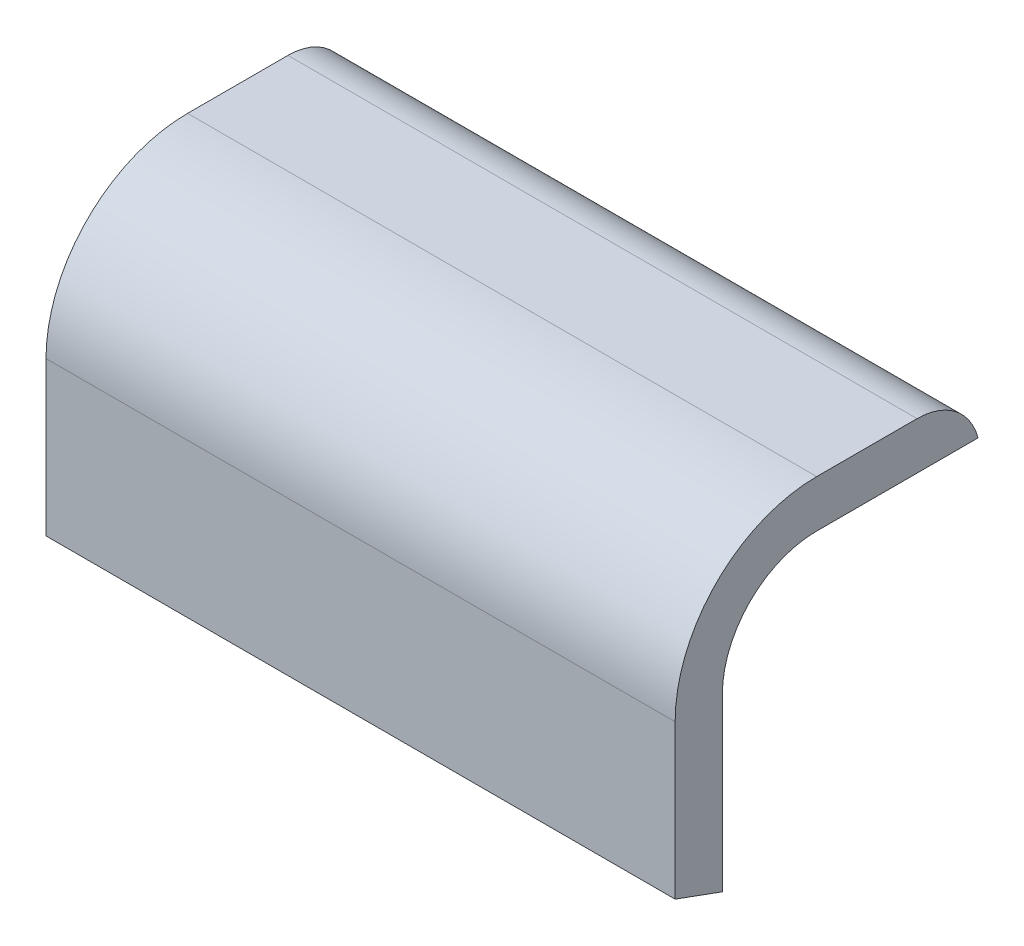
ISO-10303-21;
HEADER;
FILE_DESCRIPTION(('STEP AP214'),'2;1');
FILE_NAME('part.step','',(''),(''),'','','');
FILE_SCHEMA(('AUTOMOTIVE_DESIGN { 1 0 10303 214 1 1 1 1 }'));
ENDSEC;
DATA;
#1=APPLICATION_CONTEXT('core data for automotive mechanical design processes');
#2=APPLICATION_PROTOCOL_DEFINITION('international standard','automotive_design',2000,#1);
#3=PRODUCT_CONTEXT('',#1,'mechanical');
#4=PRODUCT('Part','Part','',(#3));
#5=PRODUCT_RELATED_PRODUCT_CATEGORY('part','',(#4));
#6=PRODUCT_DEFINITION_FORMATION('','',#4);
#7=PRODUCT_DEFINITION_CONTEXT('part definition',#1,'design');
#8=PRODUCT_DEFINITION('design','',#6,#7);
#9=PRODUCT_DEFINITION_SHAPE('','',#8);
#10=(LENGTH_UNIT() NAMED_UNIT(*) SI_UNIT(.MILLI.,.METRE.));
#11=(NAMED_UNIT(*) PLANE_ANGLE_UNIT() SI_UNIT($,.RADIAN.));
#12=(NAMED_UNIT(*) SI_UNIT($,.STERADIAN.) SOLID_ANGLE_UNIT());
#13=UNCERTAINTY_MEASURE_WITH_UNIT(LENGTH_MEASURE(1.E-05),#10,'distance_accuracy_value','');
#14=(GEOMETRIC_REPRESENTATION_CONTEXT(3) GLOBAL_UNCERTAINTY_ASSIGNED_CONTEXT((#13)) GLOBAL_UNIT_ASSIGNED_CONTEXT((#10,
#11,#12)) REPRESENTATION_CONTEXT('',''));
#15=CARTESIAN_POINT('',(0.,0.,0.));
#16=DIRECTION('',(0.,0.,1.));
#17=DIRECTION('',(1.,0.,0.));
#18=AXIS2_PLACEMENT_3D('',#15,#16,#17);
#19=CARTESIAN_POINT('',(50.,7.5,-20.32));
#20=DIRECTION('',(-1.,0.,0.));
#21=DIRECTION('',(0.,0.,1.));
#22=AXIS2_PLACEMENT_3D('',#19,#20,#21);
#23=PLANE('',#22);
#24=DIRECTION('',(0.,0.,-1.));
#25=VECTOR('',#24,1.);
#26=CARTESIAN_POINT('',(50.,7.5,-20.32));
#27=LINE('',#26,#25);
#28=CARTESIAN_POINT('',(50.,7.5,5.32));
#29=VERTEX_POINT('',#28);
#30=CARTESIAN_POINT('',(50.,7.5,-10.6375416344815));
#31=VERTEX_POINT('',#30);
#32=EDGE_CURVE('E132',#29,#31,#27,.T.);
#33=ORIENTED_EDGE('',*,*,#32,.F.);
#34=CARTESIAN_POINT('',(50.,-15.,5.32));
#35=DIRECTION('',(-1.,0.,0.));
#36=DIRECTION('',(0.,0.,1.));
#37=AXIS2_PLACEMENT_3D('',#34,#35,#36);
#38=CIRCLE('',#37,22.5);
#39=CARTESIAN_POINT('',(50.,-15.,27.82));
#40=VERTEX_POINT('',#39);
#41=EDGE_CURVE('E55',#29,#40,#38,.F.);
#42=ORIENTED_EDGE('',*,*,#41,.T.);
#43=DIRECTION('',(0.,1.,0.));
#44=VECTOR('',#43,1.);
#45=CARTESIAN_POINT('',(50.,-39.42,27.82));
#46=LINE('',#45,#44);
#47=CARTESIAN_POINT('',(50.,-39.42,27.82));
#48=VERTEX_POINT('',#47);
#49=EDGE_CURVE('E129',#48,#40,#46,.T.);
#50=ORIENTED_EDGE('',*,*,#49,.F.);
#51=DIRECTION('',(0.,-0.343150457665596,-0.939280449814587));
#52=VECTOR('',#51,1.);
#53=CARTESIAN_POINT('',(50.,-42.16,20.32));
#54=LINE('',#53,#52);
#55=CARTESIAN_POINT('',(50.,-42.16,20.32));
#56=VERTEX_POINT('',#55);
#57=EDGE_CURVE('E118',#48,#56,#54,.T.);
#58=ORIENTED_EDGE('',*,*,#57,.T.);
#59=DIRECTION('',(0.,1.,0.));
#60=VECTOR('',#59,1.);
#61=CARTESIAN_POINT('',(50.,-39.42,20.32));
#62=LINE('',#61,#60);
#63=CARTESIAN_POINT('',(50.,-15.,20.32));
#64=VERTEX_POINT('',#63);
#65=EDGE_CURVE('E110',#56,#64,#62,.T.);
#66=ORIENTED_EDGE('',*,*,#65,.T.);
#67=CARTESIAN_POINT('',(50.,-15.,5.32));
#68=DIRECTION('',(-1.,0.,0.));
#69=DIRECTION('',(0.,0.,1.));
#70=AXIS2_PLACEMENT_3D('',#67,#68,#69);
#71=CIRCLE('',#70,15.);
#72=CARTESIAN_POINT('',(50.,0.,5.32));
#73=VERTEX_POINT('',#72);
#74=EDGE_CURVE('E155',#64,#73,#71,.T.);
#75=ORIENTED_EDGE('',*,*,#74,.T.);
#76=DIRECTION('',(0.,0.,-1.));
#77=VECTOR('',#76,1.);
#78=CARTESIAN_POINT('',(50.,0.,-20.32));
#79=LINE('',#78,#77);
#80=CARTESIAN_POINT('',(50.,0.,-20.32));
#81=VERTEX_POINT('',#80);
#82=EDGE_CURVE('E109',#73,#81,#79,.T.);
#83=ORIENTED_EDGE('',*,*,#82,.T.);
#84=CARTESIAN_POINT('',(50.,-2.5,-10.6375416344815));
#85=DIRECTION('',(-1.,0.,0.));
#86=DIRECTION('',(0.,0.,1.));
#87=AXIS2_PLACEMENT_3D('',#84,#85,#86);
#88=CIRCLE('',#87,10.);
#89=EDGE_CURVE('E148',#81,#31,#88,.F.);
#90=ORIENTED_EDGE('',*,*,#89,.T.);
#91=EDGE_LOOP('',(#33,#42,#50,#58,#66,#75,#83,#90));
#92=FACE_BOUND('',#91,.T.);
#93=ADVANCED_FACE('F33',(#92),#23,.F.);
#94=CARTESIAN_POINT('',(-50.,7.5,-20.32));
#95=DIRECTION('',(1.,0.,0.));
#96=DIRECTION('',(0.,0.,-1.));
#97=AXIS2_PLACEMENT_3D('',#94,#95,#96);
#98=PLANE('',#97);
#99=DIRECTION('',(0.,1.,0.));
#100=VECTOR('',#99,1.);
#101=CARTESIAN_POINT('',(-50.,-39.42,27.82));
#102=LINE('',#101,#100);
#103=CARTESIAN_POINT('',(-50.,-39.42,27.82));
#104=VERTEX_POINT('',#103);
#105=CARTESIAN_POINT('',(-50.,-15.,27.82));
#106=VERTEX_POINT('',#105);
#107=EDGE_CURVE('E126',#104,#106,#102,.T.);
#108=ORIENTED_EDGE('',*,*,#107,.T.);
#109=CARTESIAN_POINT('',(-50.,-15.,5.32));
#110=DIRECTION('',(1.,0.,0.));
#111=DIRECTION('',(0.,0.,-1.));
#112=AXIS2_PLACEMENT_3D('',#109,#110,#111);
#113=CIRCLE('',#112,22.5);
#114=CARTESIAN_POINT('',(-50.,7.5,5.32));
#115=VERTEX_POINT('',#114);
#116=EDGE_CURVE('E11',#106,#115,#113,.F.);
#117=ORIENTED_EDGE('',*,*,#116,.T.);
#118=DIRECTION('',(0.,0.,1.));
#119=VECTOR('',#118,1.);
#120=CARTESIAN_POINT('',(-50.,7.5,-20.32));
#121=LINE('',#120,#119);
#122=CARTESIAN_POINT('',(-50.,7.5,-10.6375416344815));
#123=VERTEX_POINT('',#122);
#124=EDGE_CURVE('E134',#123,#115,#121,.T.);
#125=ORIENTED_EDGE('',*,*,#124,.F.);
#126=CARTESIAN_POINT('',(-50.,-2.5,-10.6375416344815));
#127=DIRECTION('',(1.,0.,0.));
#128=DIRECTION('',(0.,0.,-1.));
#129=AXIS2_PLACEMENT_3D('',#126,#127,#128);
#130=CIRCLE('',#129,10.);
#131=CARTESIAN_POINT('',(-50.,0.,-20.32));
#132=VERTEX_POINT('',#131);
#133=EDGE_CURVE('E146',#123,#132,#130,.F.);
#134=ORIENTED_EDGE('',*,*,#133,.T.);
#135=DIRECTION('',(0.,0.,1.));
#136=VECTOR('',#135,1.);
#137=CARTESIAN_POINT('',(-50.,0.,-20.32));
#138=LINE('',#137,#136);
#139=CARTESIAN_POINT('',(-50.,0.,5.32));
#140=VERTEX_POINT('',#139);
#141=EDGE_CURVE('E135',#132,#140,#138,.T.);
#142=ORIENTED_EDGE('',*,*,#141,.T.);
#143=CARTESIAN_POINT('',(-50.,-15.,5.32));
#144=DIRECTION('',(1.,0.,0.));
#145=DIRECTION('',(0.,0.,-1.));
#146=AXIS2_PLACEMENT_3D('',#143,#144,#145);
#147=CIRCLE('',#146,15.);
#148=CARTESIAN_POINT('',(-50.,-15.,20.32));
#149=VERTEX_POINT('',#148);
#150=EDGE_CURVE('E105',#140,#149,#147,.T.);
#151=ORIENTED_EDGE('',*,*,#150,.T.);
#152=DIRECTION('',(0.,1.,0.));
#153=VECTOR('',#152,1.);
#154=CARTESIAN_POINT('',(-50.,-39.42,20.32));
#155=LINE('',#154,#153);
#156=CARTESIAN_POINT('',(-50.,-42.16,20.32));
#157=VERTEX_POINT('',#156);
#158=EDGE_CURVE('E98',#157,#149,#155,.T.);
#159=ORIENTED_EDGE('',*,*,#158,.F.);
#160=DIRECTION('',(0.,0.343150457665596,0.939280449814587));
#161=VECTOR('',#160,1.);
#162=CARTESIAN_POINT('',(-50.,-42.16,20.32));
#163=LINE('',#162,#161);
#164=EDGE_CURVE('E102',#157,#104,#163,.T.);
#165=ORIENTED_EDGE('',*,*,#164,.T.);
#166=EDGE_LOOP('',(#108,#117,#125,#134,#142,#151,#159,#165));
#167=FACE_BOUND('',#166,.T.);
#168=ADVANCED_FACE('F100',(#167),#98,.F.);
#169=CARTESIAN_POINT('',(0.,7.5,0.));
#170=DIRECTION('',(0.,1.,0.));
#171=DIRECTION('',(0.,0.,1.));
#172=AXIS2_PLACEMENT_3D('',#169,#170,#171);
#173=PLANE('',#172);
#174=ORIENTED_EDGE('',*,*,#124,.T.);
#175=DIRECTION('',(1.,0.,0.));
#176=VECTOR('',#175,1.);
#177=CARTESIAN_POINT('',(0.,7.5,5.32));
#178=LINE('',#177,#176);
#179=EDGE_CURVE('E158',#115,#29,#178,.T.);
#180=ORIENTED_EDGE('',*,*,#179,.T.);
#181=ORIENTED_EDGE('',*,*,#32,.T.);
#182=DIRECTION('',(1.,0.,0.));
#183=VECTOR('',#182,1.);
#184=CARTESIAN_POINT('',(-50.,7.5,-10.6375416344815));
#185=LINE('',#184,#183);
#186=EDGE_CURVE('E138',#31,#123,#185,.F.);
#187=ORIENTED_EDGE('',*,*,#186,.T.);
#188=EDGE_LOOP('',(#174,#180,#181,#187));
#189=FACE_BOUND('',#188,.T.);
#190=ADVANCED_FACE('F163',(#189),#173,.T.);
#191=CARTESIAN_POINT('',(0.,0.,0.));
#192=DIRECTION('',(0.,1.,0.));
#193=DIRECTION('',(0.,0.,1.));
#194=AXIS2_PLACEMENT_3D('',#191,#192,#193);
#195=PLANE('',#194);
#196=ORIENTED_EDGE('',*,*,#82,.F.);
#197=DIRECTION('',(1.,0.,0.));
#198=VECTOR('',#197,1.);
#199=CARTESIAN_POINT('',(0.,0.,5.32));
#200=LINE('',#199,#198);
#201=EDGE_CURVE('E153',#73,#140,#200,.F.);
#202=ORIENTED_EDGE('',*,*,#201,.T.);
#203=ORIENTED_EDGE('',*,*,#141,.F.);
#204=DIRECTION('',(-1.,0.,0.));
#205=VECTOR('',#204,1.);
#206=CARTESIAN_POINT('',(-50.,0.,-20.32));
#207=LINE('',#206,#205);
#208=EDGE_CURVE('E140',#81,#132,#207,.T.);
#209=ORIENTED_EDGE('',*,*,#208,.F.);
#210=EDGE_LOOP('',(#196,#202,#203,#209));
#211=FACE_BOUND('',#210,.T.);
#212=ADVANCED_FACE('F200',(#211),#195,.F.);
#213=CARTESIAN_POINT('',(-50.,-39.42,20.32));
#214=DIRECTION('',(0.,0.,-1.));
#215=DIRECTION('',(-1.,0.,0.));
#216=AXIS2_PLACEMENT_3D('',#213,#214,#215);
#217=PLANE('',#216);
#218=ORIENTED_EDGE('',*,*,#158,.T.);
#219=DIRECTION('',(1.,0.,0.));
#220=VECTOR('',#219,1.);
#221=CARTESIAN_POINT('',(-50.,-15.,20.32));
#222=LINE('',#221,#220);
#223=EDGE_CURVE('E151',#149,#64,#222,.T.);
#224=ORIENTED_EDGE('',*,*,#223,.T.);
#225=ORIENTED_EDGE('',*,*,#65,.F.);
#226=DIRECTION('',(-1.,0.,0.));
#227=VECTOR('',#226,1.);
#228=CARTESIAN_POINT('',(62.4145886589243,-42.16,20.32));
#229=LINE('',#228,#227);
#230=EDGE_CURVE('E113',#56,#157,#229,.T.);
#231=ORIENTED_EDGE('',*,*,#230,.T.);
#232=EDGE_LOOP('',(#218,#224,#225,#231));
#233=FACE_BOUND('',#232,.T.);
#234=ADVANCED_FACE('F114',(#233),#217,.T.);
#235=CARTESIAN_POINT('',(-50.,-39.42,27.82));
#236=DIRECTION('',(0.,0.,1.));
#237=DIRECTION('',(1.,0.,0.));
#238=AXIS2_PLACEMENT_3D('',#235,#236,#237);
#239=PLANE('',#238);
#240=ORIENTED_EDGE('',*,*,#49,.T.);
#241=DIRECTION('',(1.,0.,0.));
#242=VECTOR('',#241,1.);
#243=CARTESIAN_POINT('',(-50.,-15.,27.82));
#244=LINE('',#243,#242);
#245=EDGE_CURVE('E41',#40,#106,#244,.F.);
#246=ORIENTED_EDGE('',*,*,#245,.T.);
#247=ORIENTED_EDGE('',*,*,#107,.F.);
#248=DIRECTION('',(1.,0.,0.));
#249=VECTOR('',#248,1.);
#250=CARTESIAN_POINT('',(-50.,-39.42,27.82));
#251=LINE('',#250,#249);
#252=EDGE_CURVE('E122',#104,#48,#251,.T.);
#253=ORIENTED_EDGE('',*,*,#252,.T.);
#254=EDGE_LOOP('',(#240,#246,#247,#253));
#255=FACE_BOUND('',#254,.T.);
#256=ADVANCED_FACE('F192',(#255),#239,.T.);
#257=CARTESIAN_POINT('',(62.4145886589243,-42.16,20.32));
#258=DIRECTION('',(0.,-0.939280449814587,0.343150457665596));
#259=DIRECTION('',(0.,-0.343150457665596,-0.939280449814587));
#260=AXIS2_PLACEMENT_3D('',#257,#258,#259);
#261=PLANE('',#260);
#262=ORIENTED_EDGE('',*,*,#57,.F.);
#263=ORIENTED_EDGE('',*,*,#252,.F.);
#264=ORIENTED_EDGE('',*,*,#164,.F.);
#265=ORIENTED_EDGE('',*,*,#230,.F.);
#266=EDGE_LOOP('',(#262,#263,#264,#265));
#267=FACE_BOUND('',#266,.T.);
#268=ADVANCED_FACE('F120',(#267),#261,.T.);
#269=CARTESIAN_POINT('',(-50.,-2.5,-10.6375416344815));
#270=DIRECTION('',(-1.,0.,0.));
#271=DIRECTION('',(0.,0.,1.));
#272=AXIS2_PLACEMENT_3D('',#269,#270,#271);
#273=CYLINDRICAL_SURFACE('',#272,10.);
#274=ORIENTED_EDGE('',*,*,#89,.F.);
#275=ORIENTED_EDGE('',*,*,#208,.T.);
#276=ORIENTED_EDGE('',*,*,#133,.F.);
#277=ORIENTED_EDGE('',*,*,#186,.F.);
#278=EDGE_LOOP('',(#274,#275,#276,#277));
#279=FACE_BOUND('',#278,.T.);
#280=ADVANCED_FACE('F172',(#279),#273,.T.);
#281=CARTESIAN_POINT('',(-50.,-15.,5.32));
#282=DIRECTION('',(1.,0.,0.));
#283=DIRECTION('',(0.,0.,-1.));
#284=AXIS2_PLACEMENT_3D('',#281,#282,#283);
#285=CYLINDRICAL_SURFACE('',#284,15.);
#286=ORIENTED_EDGE('',*,*,#150,.F.);
#287=ORIENTED_EDGE('',*,*,#201,.F.);
#288=ORIENTED_EDGE('',*,*,#74,.F.);
#289=ORIENTED_EDGE('',*,*,#223,.F.);
#290=EDGE_LOOP('',(#286,#287,#288,#289));
#291=FACE_BOUND('',#290,.T.);
#292=ADVANCED_FACE('F175',(#291),#285,.F.);
#293=CARTESIAN_POINT('',(0.,-15.,5.32));
#294=DIRECTION('',(1.,0.,0.));
#295=DIRECTION('',(0.,0.,-1.));
#296=AXIS2_PLACEMENT_3D('',#293,#294,#295);
#297=CYLINDRICAL_SURFACE('',#296,22.5);
#298=ORIENTED_EDGE('',*,*,#116,.F.);
#299=ORIENTED_EDGE('',*,*,#245,.F.);
#300=ORIENTED_EDGE('',*,*,#41,.F.);
#301=ORIENTED_EDGE('',*,*,#179,.F.);
#302=EDGE_LOOP('',(#298,#299,#300,#301));
#303=FACE_BOUND('',#302,.T.);
#304=ADVANCED_FACE('F35',(#303),#297,.T.);
#305=CLOSED_SHELL('',(#93,#168,#190,#212,#234,#256,#268,#280,#292,#304));
#306=MANIFOLD_SOLID_BREP('B2',#305);
#307=ADVANCED_BREP_SHAPE_REPRESENTATION('',(#18,#306),#14);
#308=SHAPE_DEFINITION_REPRESENTATION(#9,#307);
ENDSEC;
END-ISO-10303-21;
